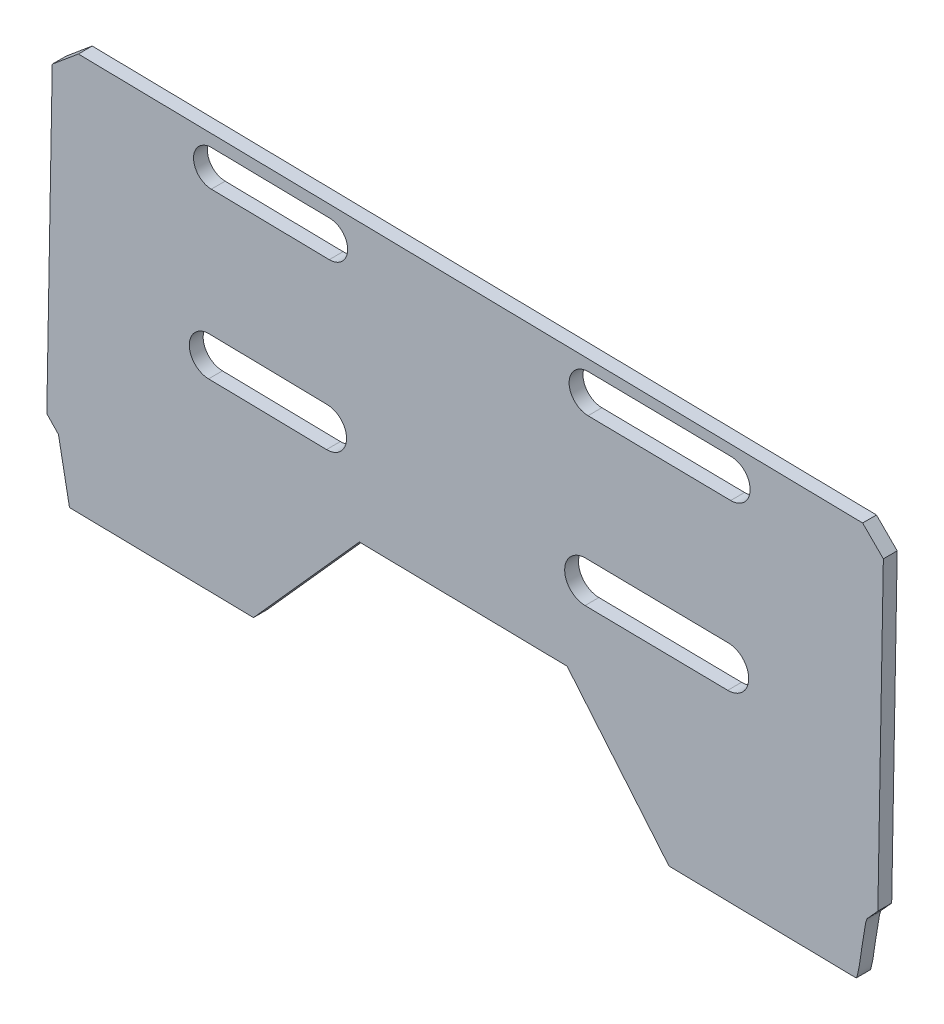
ISO-10303-21;
HEADER;
FILE_DESCRIPTION(('STEP AP214'),'2;1');
FILE_NAME('part.step','',(''),(''),'','','');
FILE_SCHEMA(('AUTOMOTIVE_DESIGN { 1 0 10303 214 1 1 1 1 }'));
ENDSEC;
DATA;
#1=APPLICATION_CONTEXT('core data for automotive mechanical design processes');
#2=APPLICATION_PROTOCOL_DEFINITION('international standard','automotive_design',2000,#1);
#3=PRODUCT_CONTEXT('',#1,'mechanical');
#4=PRODUCT('Part','Part','',(#3));
#5=PRODUCT_RELATED_PRODUCT_CATEGORY('part','',(#4));
#6=PRODUCT_DEFINITION_FORMATION('','',#4);
#7=PRODUCT_DEFINITION_CONTEXT('part definition',#1,'design');
#8=PRODUCT_DEFINITION('design','',#6,#7);
#9=PRODUCT_DEFINITION_SHAPE('','',#8);
#10=(LENGTH_UNIT() NAMED_UNIT(*) SI_UNIT(.MILLI.,.METRE.));
#11=(NAMED_UNIT(*) PLANE_ANGLE_UNIT() SI_UNIT($,.RADIAN.));
#12=(NAMED_UNIT(*) SI_UNIT($,.STERADIAN.) SOLID_ANGLE_UNIT());
#13=UNCERTAINTY_MEASURE_WITH_UNIT(LENGTH_MEASURE(1.E-05),#10,'distance_accuracy_value','');
#14=(GEOMETRIC_REPRESENTATION_CONTEXT(3) GLOBAL_UNCERTAINTY_ASSIGNED_CONTEXT((#13)) GLOBAL_UNIT_ASSIGNED_CONTEXT((#10,
#11,#12)) REPRESENTATION_CONTEXT('',''));
#15=CARTESIAN_POINT('',(0.,0.,0.));
#16=DIRECTION('',(0.,0.,1.));
#17=DIRECTION('',(1.,0.,0.));
#18=AXIS2_PLACEMENT_3D('',#15,#16,#17);
#19=CARTESIAN_POINT('',(189.712630334852,-41.2156411177829,3.5));
#20=CARTESIAN_POINT('',(190.597710334852,-40.2365511177829,3.5));
#21=CARTESIAN_POINT('',(191.646800334852,-27.7610111177829,3.5));
#22=CARTESIAN_POINT('',(192.531880334852,-26.7818511177829,3.5));
#23=B_SPLINE_CURVE_WITH_KNOTS('',3,(#19,#20,#21,#22),.UNSPECIFIED.,.F.,.F.,(4,4),
(0.926829268292683,0.951219512195122),.UNSPECIFIED.);
#24=DIRECTION('',(0.,0.,-1.));
#25=VECTOR('',#24,1.);
#26=SURFACE_OF_LINEAR_EXTRUSION('',#23,#25);
#27=CARTESIAN_POINT('',(189.712630334852,-41.2156411177829,0.));
#28=CARTESIAN_POINT('',(190.597710334852,-40.2365511177829,0.));
#29=CARTESIAN_POINT('',(191.646800334852,-27.7610111177829,0.));
#30=CARTESIAN_POINT('',(192.531880334852,-26.7818511177829,0.));
#31=B_SPLINE_CURVE_WITH_KNOTS('',3,(#27,#28,#29,#30),.UNSPECIFIED.,.F.,.F.,(4,4),
(0.926829268292683,0.951219512195122),.UNSPECIFIED.);
#32=CARTESIAN_POINT('',(189.712630334852,-41.2156411177829,0.));
#33=VERTEX_POINT('',#32);
#34=CARTESIAN_POINT('',(192.531880334852,-26.7818511177829,0.));
#35=VERTEX_POINT('',#34);
#36=EDGE_CURVE('E325',#33,#35,#31,.T.);
#37=ORIENTED_EDGE('',*,*,#36,.T.);
#38=DIRECTION('',(0.,0.,-1.));
#39=VECTOR('',#38,1.);
#40=CARTESIAN_POINT('',(192.531880334852,-26.7818511177829,3.5));
#41=LINE('',#40,#39);
#42=CARTESIAN_POINT('',(192.531880334852,-26.7818511177829,3.5));
#43=VERTEX_POINT('',#42);
#44=EDGE_CURVE('E11',#43,#35,#41,.T.);
#45=ORIENTED_EDGE('',*,*,#44,.F.);
#46=CARTESIAN_POINT('',(189.712630334852,-41.2156411177829,3.5));
#47=VERTEX_POINT('',#46);
#48=EDGE_CURVE('E482',#47,#43,#23,.T.);
#49=ORIENTED_EDGE('',*,*,#48,.F.);
#50=DIRECTION('',(0.,0.,-1.));
#51=VECTOR('',#50,1.);
#52=CARTESIAN_POINT('',(189.712630334852,-41.2156411177829,3.5));
#53=LINE('',#52,#51);
#54=EDGE_CURVE('E60',#47,#33,#53,.T.);
#55=ORIENTED_EDGE('',*,*,#54,.T.);
#56=EDGE_LOOP('',(#37,#45,#49,#55));
#57=FACE_BOUND('',#56,.T.);
#58=ADVANCED_FACE('F41',(#57),#26,.F.);
#59=CARTESIAN_POINT('',(192.531880334852,-26.7818511177829,3.5));
#60=CARTESIAN_POINT('',(193.416960334852,-25.8026911177829,3.5));
#61=CARTESIAN_POINT('',(194.302040334852,-24.8234611177829,3.5));
#62=CARTESIAN_POINT('',(195.187190334852,-23.8443011177829,3.5));
#63=B_SPLINE_CURVE_WITH_KNOTS('',3,(#59,#60,#61,#62),.UNSPECIFIED.,.F.,.F.,(4,4),
(0.951219512195122,1.),.UNSPECIFIED.);
#64=DIRECTION('',(0.,0.,-1.));
#65=VECTOR('',#64,1.);
#66=SURFACE_OF_LINEAR_EXTRUSION('',#63,#65);
#67=CARTESIAN_POINT('',(192.531880334852,-26.7818511177829,0.));
#68=CARTESIAN_POINT('',(193.416960334852,-25.8026911177829,0.));
#69=CARTESIAN_POINT('',(194.302040334852,-24.8234611177829,0.));
#70=CARTESIAN_POINT('',(195.187190334852,-23.8443011177829,0.));
#71=B_SPLINE_CURVE_WITH_KNOTS('',3,(#67,#68,#69,#70),.UNSPECIFIED.,.F.,.F.,(4,4),
(0.951219512195122,1.),.UNSPECIFIED.);
#72=CARTESIAN_POINT('',(195.187190334852,-23.8443011177829,0.));
#73=VERTEX_POINT('',#72);
#74=EDGE_CURVE('E329',#35,#73,#71,.T.);
#75=ORIENTED_EDGE('',*,*,#74,.T.);
#76=DIRECTION('',(0.,0.,-1.));
#77=VECTOR('',#76,1.);
#78=CARTESIAN_POINT('',(195.187190334852,-23.8443011177829,3.5));
#79=LINE('',#78,#77);
#80=CARTESIAN_POINT('',(195.187190334852,-23.8443011177829,3.5));
#81=VERTEX_POINT('',#80);
#82=EDGE_CURVE('E51',#81,#73,#79,.T.);
#83=ORIENTED_EDGE('',*,*,#82,.F.);
#84=EDGE_CURVE('E487',#43,#81,#63,.T.);
#85=ORIENTED_EDGE('',*,*,#84,.F.);
#86=ORIENTED_EDGE('',*,*,#44,.T.);
#87=EDGE_LOOP('',(#75,#83,#85,#86));
#88=FACE_BOUND('',#87,.T.);
#89=ADVANCED_FACE('F499',(#88),#66,.F.);
#90=CARTESIAN_POINT('',(195.5508581937,-3.49468877886996,3.5));
#91=DIRECTION('',(0.999840351974433,-0.0178681438219279,0.));
#92=DIRECTION('',(0.0178681438219279,0.999840351974433,0.));
#93=AXIS2_PLACEMENT_3D('',#90,#91,#92);
#94=PLANE('',#93);
#95=DIRECTION('',(-0.0178681438219279,-0.999840351974433,0.));
#96=VECTOR('',#95,1.);
#97=CARTESIAN_POINT('',(195.5508581937,-3.49468877886996,0.));
#98=LINE('',#97,#96);
#99=CARTESIAN_POINT('',(196.577110334852,53.9308788822172,0.));
#100=VERTEX_POINT('',#99);
#101=EDGE_CURVE('E337',#100,#73,#98,.T.);
#102=ORIENTED_EDGE('',*,*,#101,.F.);
#103=DIRECTION('',(0.,0.,-1.));
#104=VECTOR('',#103,1.);
#105=CARTESIAN_POINT('',(196.577110334852,53.9308788822172,3.5));
#106=LINE('',#105,#104);
#107=CARTESIAN_POINT('',(196.577110334852,53.9308788822172,3.5));
#108=VERTEX_POINT('',#107);
#109=EDGE_CURVE('E392',#108,#100,#106,.T.);
#110=ORIENTED_EDGE('',*,*,#109,.F.);
#111=DIRECTION('',(-0.0178681438219279,-0.999840351974433,0.));
#112=VECTOR('',#111,1.);
#113=CARTESIAN_POINT('',(195.5508581937,-3.49468877886996,3.5));
#114=LINE('',#113,#112);
#115=EDGE_CURVE('E799',#108,#81,#114,.T.);
#116=ORIENTED_EDGE('',*,*,#115,.T.);
#117=ORIENTED_EDGE('',*,*,#82,.T.);
#118=EDGE_LOOP('',(#102,#110,#116,#117));
#119=FACE_BOUND('',#118,.T.);
#120=ADVANCED_FACE('F670',(#119),#94,.T.);
#121=CARTESIAN_POINT('',(125.129053481797,125.288186816212,3.5));
#122=DIRECTION('',(0.706657291406756,0.707555985418586,0.));
#123=DIRECTION('',(-0.707555985418586,0.706657291406756,0.));
#124=AXIS2_PLACEMENT_3D('',#121,#122,#123);
#125=PLANE('',#124);
#126=DIRECTION('',(0.707555985418586,-0.706657291406756,0.));
#127=VECTOR('',#126,1.);
#128=CARTESIAN_POINT('',(125.129053481797,125.288186816212,0.));
#129=LINE('',#128,#127);
#130=CARTESIAN_POINT('',(191.341460334852,59.1598788822171,0.));
#131=VERTEX_POINT('',#130);
#132=EDGE_CURVE('E343',#131,#100,#129,.T.);
#133=ORIENTED_EDGE('',*,*,#132,.F.);
#134=DIRECTION('',(0.,0.,-1.));
#135=VECTOR('',#134,1.);
#136=CARTESIAN_POINT('',(191.341460334852,59.1598788822171,3.5));
#137=LINE('',#136,#135);
#138=CARTESIAN_POINT('',(191.341460334852,59.1598788822171,3.5));
#139=VERTEX_POINT('',#138);
#140=EDGE_CURVE('E390',#139,#131,#137,.T.);
#141=ORIENTED_EDGE('',*,*,#140,.F.);
#142=DIRECTION('',(0.707555985418586,-0.706657291406756,0.));
#143=VECTOR('',#142,1.);
#144=CARTESIAN_POINT('',(125.129053481797,125.288186816212,3.5));
#145=LINE('',#144,#143);
#146=EDGE_CURVE('E800',#139,#108,#145,.T.);
#147=ORIENTED_EDGE('',*,*,#146,.T.);
#148=ORIENTED_EDGE('',*,*,#109,.T.);
#149=EDGE_LOOP('',(#133,#141,#147,#148));
#150=FACE_BOUND('',#149,.T.);
#151=ADVANCED_FACE('F662',(#150),#125,.T.);
#152=CARTESIAN_POINT('',(1.11802061192249,62.5594261536194,3.5));
#153=DIRECTION('',(0.0178684841608716,0.999840345892179,0.));
#154=DIRECTION('',(-0.999840345892179,0.0178684841608716,0.));
#155=AXIS2_PLACEMENT_3D('',#152,#153,#154);
#156=PLANE('',#155);
#157=DIRECTION('',(0.999840345892179,-0.0178684841608716,0.));
#158=VECTOR('',#157,1.);
#159=CARTESIAN_POINT('',(1.11802061192249,62.5594261536194,0.));
#160=LINE('',#159,#158);
#161=CARTESIAN_POINT('',(-6.79815966514825,62.7008988822171,0.));
#162=VERTEX_POINT('',#161);
#163=EDGE_CURVE('E346',#162,#131,#160,.T.);
#164=ORIENTED_EDGE('',*,*,#163,.F.);
#165=DIRECTION('',(0.,0.,-1.));
#166=VECTOR('',#165,1.);
#167=CARTESIAN_POINT('',(-6.79815966514825,62.7008988822171,3.5));
#168=LINE('',#167,#166);
#169=CARTESIAN_POINT('',(-6.79815966514825,62.7008988822171,3.5));
#170=VERTEX_POINT('',#169);
#171=EDGE_CURVE('E388',#170,#162,#168,.T.);
#172=ORIENTED_EDGE('',*,*,#171,.F.);
#173=DIRECTION('',(0.999840345892179,-0.0178684841608716,0.));
#174=VECTOR('',#173,1.);
#175=CARTESIAN_POINT('',(1.11802061192249,62.5594261536194,3.5));
#176=LINE('',#175,#174);
#177=EDGE_CURVE('E802',#170,#139,#176,.T.);
#178=ORIENTED_EDGE('',*,*,#177,.T.);
#179=ORIENTED_EDGE('',*,*,#140,.T.);
#180=EDGE_LOOP('',(#164,#172,#178,#179));
#181=FACE_BOUND('',#180,.T.);
#182=ADVANCED_FACE('F654',(#181),#156,.T.);
#183=CARTESIAN_POINT('',(-33.641178836427,40.2846461990089,3.5));
#184=DIRECTION('',(-0.640978381306723,0.767558932393737,0.));
#185=DIRECTION('',(-0.767558932393737,-0.640978381306723,0.));
#186=AXIS2_PLACEMENT_3D('',#183,#184,#185);
#187=PLANE('',#186);
#188=DIRECTION('',(0.767558932393737,0.640978381306723,0.));
#189=VECTOR('',#188,1.);
#190=CARTESIAN_POINT('',(-33.641178836427,40.2846461990089,0.));
#191=LINE('',#190,#189);
#192=CARTESIAN_POINT('',(-13.3981796651483,57.1893088822171,0.));
#193=VERTEX_POINT('',#192);
#194=EDGE_CURVE('E349',#193,#162,#191,.T.);
#195=ORIENTED_EDGE('',*,*,#194,.F.);
#196=DIRECTION('',(0.,0.,-1.));
#197=VECTOR('',#196,1.);
#198=CARTESIAN_POINT('',(-13.3981796651483,57.1893088822171,3.5));
#199=LINE('',#198,#197);
#200=CARTESIAN_POINT('',(-13.3981796651483,57.1893088822171,3.5));
#201=VERTEX_POINT('',#200);
#202=EDGE_CURVE('E386',#201,#193,#199,.T.);
#203=ORIENTED_EDGE('',*,*,#202,.F.);
#204=DIRECTION('',(0.767558932393737,0.640978381306723,0.));
#205=VECTOR('',#204,1.);
#206=CARTESIAN_POINT('',(-33.641178836427,40.2846461990089,3.5));
#207=LINE('',#206,#205);
#208=EDGE_CURVE('E807',#201,#170,#207,.T.);
#209=ORIENTED_EDGE('',*,*,#208,.T.);
#210=ORIENTED_EDGE('',*,*,#171,.T.);
#211=EDGE_LOOP('',(#195,#203,#209,#210));
#212=FACE_BOUND('',#211,.T.);
#213=ADVANCED_FACE('F646',(#212),#187,.T.);
#214=CARTESIAN_POINT('',(-14.4155844214953,0.25761545587832,3.5));
#215=DIRECTION('',(0.999840358676074,-0.0178677688170455,0.));
#216=DIRECTION('',(0.0178677688170455,0.999840358676074,0.));
#217=AXIS2_PLACEMENT_3D('',#214,#215,#216);
#218=PLANE('',#217);
#219=DIRECTION('',(-0.0178677688170455,-0.999840358676074,0.));
#220=VECTOR('',#219,1.);
#221=CARTESIAN_POINT('',(-14.4155844214953,0.25761545587832,0.));
#222=LINE('',#221,#220);
#223=CARTESIAN_POINT('',(-14.7770396651482,-19.9686111177829,0.));
#224=VERTEX_POINT('',#223);
#225=EDGE_CURVE('E352',#193,#224,#222,.T.);
#226=ORIENTED_EDGE('',*,*,#225,.T.);
#227=DIRECTION('',(0.,0.,-1.));
#228=VECTOR('',#227,1.);
#229=CARTESIAN_POINT('',(-14.7770396651482,-19.9686111177829,3.5));
#230=LINE('',#229,#228);
#231=CARTESIAN_POINT('',(-14.7770396651482,-19.9686111177829,3.5));
#232=VERTEX_POINT('',#231);
#233=EDGE_CURVE('E383',#232,#224,#230,.T.);
#234=ORIENTED_EDGE('',*,*,#233,.F.);
#235=DIRECTION('',(-0.0178677688170455,-0.999840358676074,0.));
#236=VECTOR('',#235,1.);
#237=CARTESIAN_POINT('',(-14.4155844214953,0.25761545587832,3.5));
#238=LINE('',#237,#236);
#239=EDGE_CURVE('E810',#201,#232,#238,.T.);
#240=ORIENTED_EDGE('',*,*,#239,.F.);
#241=ORIENTED_EDGE('',*,*,#202,.T.);
#242=EDGE_LOOP('',(#226,#234,#240,#241));
#243=FACE_BOUND('',#242,.T.);
#244=ADVANCED_FACE('F638',(#243),#218,.F.);
#245=CARTESIAN_POINT('',(-17.7295798860647,-16.8646441973417,3.5));
#246=DIRECTION('',(0.724559656241038,0.689212089670421,0.));
#247=DIRECTION('',(-0.689212089670421,0.724559656241038,0.));
#248=AXIS2_PLACEMENT_3D('',#245,#246,#247);
#249=PLANE('',#248);
#250=DIRECTION('',(0.689212089670421,-0.724559656241038,0.));
#251=VECTOR('',#250,1.);
#252=CARTESIAN_POINT('',(-17.7295798860647,-16.8646441973417,0.));
#253=LINE('',#252,#251);
#254=CARTESIAN_POINT('',(-11.8289196651482,-23.0679311177829,0.));
#255=VERTEX_POINT('',#254);
#256=EDGE_CURVE('E354',#224,#255,#253,.T.);
#257=ORIENTED_EDGE('',*,*,#256,.T.);
#258=DIRECTION('',(0.,0.,-1.));
#259=VECTOR('',#258,1.);
#260=CARTESIAN_POINT('',(-11.8289196651482,-23.0679311177829,3.5));
#261=LINE('',#260,#259);
#262=CARTESIAN_POINT('',(-11.8289196651482,-23.0679311177829,3.5));
#263=VERTEX_POINT('',#262);
#264=EDGE_CURVE('E380',#263,#255,#261,.T.);
#265=ORIENTED_EDGE('',*,*,#264,.F.);
#266=DIRECTION('',(0.689212089670421,-0.724559656241038,0.));
#267=VECTOR('',#266,1.);
#268=CARTESIAN_POINT('',(-17.7295798860647,-16.8646441973417,3.5));
#269=LINE('',#268,#267);
#270=EDGE_CURVE('E812',#232,#263,#269,.T.);
#271=ORIENTED_EDGE('',*,*,#270,.F.);
#272=ORIENTED_EDGE('',*,*,#233,.T.);
#273=EDGE_LOOP('',(#257,#265,#271,#272));
#274=FACE_BOUND('',#273,.T.);
#275=ADVANCED_FACE('F630',(#274),#249,.F.);
#276=CARTESIAN_POINT('',(-15.6594890108642,-2.9871765162684,3.5));
#277=DIRECTION('',(0.982287606039838,0.187379451969855,0.));
#278=DIRECTION('',(-0.187379451969855,0.982287606039838,0.));
#279=AXIS2_PLACEMENT_3D('',#276,#277,#278);
#280=PLANE('',#279);
#281=DIRECTION('',(0.187379451969855,-0.982287606039838,0.));
#282=VECTOR('',#281,1.);
#283=CARTESIAN_POINT('',(-15.6594890108642,-2.9871765162684,0.));
#284=LINE('',#283,#282);
#285=CARTESIAN_POINT('',(-9.04466966514825,-37.6636311177829,0.));
#286=VERTEX_POINT('',#285);
#287=EDGE_CURVE('E356',#255,#286,#284,.T.);
#288=ORIENTED_EDGE('',*,*,#287,.T.);
#289=DIRECTION('',(0.,0.,-1.));
#290=VECTOR('',#289,1.);
#291=CARTESIAN_POINT('',(-9.04466966514825,-37.6636311177829,3.5));
#292=LINE('',#291,#290);
#293=CARTESIAN_POINT('',(-9.04466966514825,-37.6636311177829,3.5));
#294=VERTEX_POINT('',#293);
#295=EDGE_CURVE('E378',#294,#286,#292,.T.);
#296=ORIENTED_EDGE('',*,*,#295,.F.);
#297=DIRECTION('',(0.187379451969855,-0.982287606039838,0.));
#298=VECTOR('',#297,1.);
#299=CARTESIAN_POINT('',(-15.6594890108642,-2.9871765162684,3.5));
#300=LINE('',#299,#298);
#301=EDGE_CURVE('E814',#263,#294,#300,.T.);
#302=ORIENTED_EDGE('',*,*,#301,.F.);
#303=ORIENTED_EDGE('',*,*,#264,.T.);
#304=EDGE_LOOP('',(#288,#296,#302,#303));
#305=FACE_BOUND('',#304,.T.);
#306=ADVANCED_FACE('F622',(#305),#280,.F.);
#307=CARTESIAN_POINT('',(-0.675817377512351,-37.8132036285223,3.5));
#308=DIRECTION('',(-0.0178696698859134,-0.999840324700984,0.));
#309=DIRECTION('',(0.999840324700984,-0.0178696698859134,0.));
#310=AXIS2_PLACEMENT_3D('',#307,#308,#309);
#311=PLANE('',#310);
#312=DIRECTION('',(-0.999840324700984,0.0178696698859134,0.));
#313=VECTOR('',#312,1.);
#314=CARTESIAN_POINT('',(-0.675817377512351,-37.8132036285223,0.));
#315=LINE('',#314,#313);
#316=CARTESIAN_POINT('',(37.4417703348518,-38.4944611177829,0.));
#317=VERTEX_POINT('',#316);
#318=EDGE_CURVE('E359',#317,#286,#315,.T.);
#319=ORIENTED_EDGE('',*,*,#318,.F.);
#320=DIRECTION('',(0.,0.,-1.));
#321=VECTOR('',#320,1.);
#322=CARTESIAN_POINT('',(37.4417703348518,-38.4944611177829,3.5));
#323=LINE('',#322,#321);
#324=CARTESIAN_POINT('',(37.4417703348518,-38.4944611177829,3.5));
#325=VERTEX_POINT('',#324);
#326=EDGE_CURVE('E376',#325,#317,#323,.T.);
#327=ORIENTED_EDGE('',*,*,#326,.F.);
#328=DIRECTION('',(-0.999840324700984,0.0178696698859134,0.));
#329=VECTOR('',#328,1.);
#330=CARTESIAN_POINT('',(-0.675817377512351,-37.8132036285223,3.5));
#331=LINE('',#330,#329);
#332=EDGE_CURVE('E271',#325,#294,#331,.T.);
#333=ORIENTED_EDGE('',*,*,#332,.T.);
#334=ORIENTED_EDGE('',*,*,#295,.T.);
#335=EDGE_LOOP('',(#319,#327,#333,#334));
#336=FACE_BOUND('',#335,.T.);
#337=ADVANCED_FACE('F614',(#336),#311,.T.);
#338=CARTESIAN_POINT('',(39.9351512914236,-35.7057340892636,3.5));
#339=DIRECTION('',(-0.745479822272443,0.666528194890994,0.));
#340=DIRECTION('',(-0.666528194890994,-0.745479822272443,0.));
#341=AXIS2_PLACEMENT_3D('',#338,#339,#340);
#342=PLANE('',#341);
#343=DIRECTION('',(0.666528194890994,0.745479822272443,0.));
#344=VECTOR('',#343,1.);
#345=CARTESIAN_POINT('',(39.9351512914236,-35.7057340892636,0.));
#346=LINE('',#345,#344);
#347=CARTESIAN_POINT('',(64.1890503348518,-8.57891111778286,0.));
#348=VERTEX_POINT('',#347);
#349=EDGE_CURVE('E362',#317,#348,#346,.T.);
#350=ORIENTED_EDGE('',*,*,#349,.T.);
#351=DIRECTION('',(0.,0.,-1.));
#352=VECTOR('',#351,1.);
#353=CARTESIAN_POINT('',(64.1890503348518,-8.57891111778286,3.5));
#354=LINE('',#353,#352);
#355=CARTESIAN_POINT('',(64.1890503348518,-8.57891111778286,3.5));
#356=VERTEX_POINT('',#355);
#357=EDGE_CURVE('E256',#356,#348,#354,.T.);
#358=ORIENTED_EDGE('',*,*,#357,.F.);
#359=DIRECTION('',(0.666528194890994,0.745479822272443,0.));
#360=VECTOR('',#359,1.);
#361=CARTESIAN_POINT('',(39.9351512914236,-35.7057340892636,3.5));
#362=LINE('',#361,#360);
#363=EDGE_CURVE('E268',#325,#356,#362,.T.);
#364=ORIENTED_EDGE('',*,*,#363,.F.);
#365=ORIENTED_EDGE('',*,*,#326,.T.);
#366=EDGE_LOOP('',(#350,#358,#364,#365));
#367=FACE_BOUND('',#366,.T.);
#368=ADVANCED_FACE('F607',(#367),#342,.F.);
#369=CARTESIAN_POINT('',(-0.132770207534705,-7.42942491053834,3.5));
#370=DIRECTION('',(-0.017868006333995,-0.99984035443147,0.));
#371=DIRECTION('',(0.99984035443147,-0.017868006333995,0.));
#372=AXIS2_PLACEMENT_3D('',#369,#370,#371);
#373=PLANE('',#372);
#374=DIRECTION('',(-0.999840354431471,0.017868006333995,0.));
#375=VECTOR('',#374,1.);
#376=CARTESIAN_POINT('',(-0.132770207534705,-7.42942491053834,0.));
#377=LINE('',#376,#375);
#378=CARTESIAN_POINT('',(116.680650334852,-9.51698111778286,0.));
#379=VERTEX_POINT('',#378);
#380=EDGE_CURVE('E253',#379,#348,#377,.T.);
#381=ORIENTED_EDGE('',*,*,#380,.F.);
#382=DIRECTION('',(0.,0.,-1.));
#383=VECTOR('',#382,1.);
#384=CARTESIAN_POINT('',(116.680650334852,-9.51698111778286,3.5));
#385=LINE('',#384,#383);
#386=CARTESIAN_POINT('',(116.680650334852,-9.51698111778286,3.5));
#387=VERTEX_POINT('',#386);
#388=EDGE_CURVE('E247',#387,#379,#385,.T.);
#389=ORIENTED_EDGE('',*,*,#388,.F.);
#390=DIRECTION('',(-0.999840354431471,0.017868006333995,0.));
#391=VECTOR('',#390,1.);
#392=CARTESIAN_POINT('',(-0.132770207534705,-7.42942491053834,3.5));
#393=LINE('',#392,#391);
#394=EDGE_CURVE('E251',#387,#356,#393,.T.);
#395=ORIENTED_EDGE('',*,*,#394,.T.);
#396=ORIENTED_EDGE('',*,*,#357,.T.);
#397=EDGE_LOOP('',(#381,#389,#395,#396));
#398=FACE_BOUND('',#397,.T.);
#399=ADVANCED_FACE('F249',(#398),#373,.T.);
#400=CARTESIAN_POINT('',(64.1066729518021,53.4908528388642,3.5));
#401=DIRECTION('',(0.767816894533482,0.640669350343031,0.));
#402=DIRECTION('',(-0.640669350343031,0.767816894533482,0.));
#403=AXIS2_PLACEMENT_3D('',#400,#401,#402);
#404=PLANE('',#403);
#405=DIRECTION('',(0.640669350343031,-0.767816894533482,0.));
#406=VECTOR('',#405,1.);
#407=CARTESIAN_POINT('',(64.1066729518021,53.4908528388642,0.));
#408=LINE('',#407,#406);
#409=CARTESIAN_POINT('',(142.424970334852,-40.3705311177829,0.));
#410=VERTEX_POINT('',#409);
#411=EDGE_CURVE('E366',#379,#410,#408,.T.);
#412=ORIENTED_EDGE('',*,*,#411,.T.);
#413=DIRECTION('',(0.,0.,-1.));
#414=VECTOR('',#413,1.);
#415=CARTESIAN_POINT('',(142.424970334852,-40.3705311177829,3.5));
#416=LINE('',#415,#414);
#417=CARTESIAN_POINT('',(142.424970334852,-40.3705311177829,3.5));
#418=VERTEX_POINT('',#417);
#419=EDGE_CURVE('E153',#418,#410,#416,.T.);
#420=ORIENTED_EDGE('',*,*,#419,.F.);
#421=DIRECTION('',(0.640669350343031,-0.767816894533482,0.));
#422=VECTOR('',#421,1.);
#423=CARTESIAN_POINT('',(64.1066729518021,53.4908528388642,3.5));
#424=LINE('',#423,#422);
#425=EDGE_CURVE('E258',#387,#418,#424,.T.);
#426=ORIENTED_EDGE('',*,*,#425,.F.);
#427=ORIENTED_EDGE('',*,*,#388,.T.);
#428=EDGE_LOOP('',(#412,#420,#426,#427));
#429=FACE_BOUND('',#428,.T.);
#430=ADVANCED_FACE('F259',(#429),#404,.F.);
#431=CARTESIAN_POINT('',(26.1924081525457,13.0321981525457,3.5));
#432=DIRECTION('',(0.,0.,-1.));
#433=DIRECTION('',(-1.,0.,0.));
#434=AXIS2_PLACEMENT_3D('',#431,#432,#433);
#435=CYLINDRICAL_SURFACE('',#434,4.96444405954844);
#436=CARTESIAN_POINT('',(26.1924081525457,13.0321981525457,0.));
#437=DIRECTION('',(0.,0.,1.));
#438=DIRECTION('',(1.,0.,0.));
#439=AXIS2_PLACEMENT_3D('',#436,#437,#438);
#440=CIRCLE('',#439,4.96444405954844);
#441=CARTESIAN_POINT('',(26.2864253865253,17.995751877459,0.));
#442=VERTEX_POINT('',#441);
#443=CARTESIAN_POINT('',(26.0983909185662,8.06864442763242,0.));
#444=VERTEX_POINT('',#443);
#445=EDGE_CURVE('E313',#442,#444,#440,.T.);
#446=ORIENTED_EDGE('',*,*,#445,.F.);
#447=DIRECTION('',(0.,0.,-1.));
#448=VECTOR('',#447,1.);
#449=CARTESIAN_POINT('',(26.2864253865253,17.995751877459,3.5));
#450=LINE('',#449,#448);
#451=CARTESIAN_POINT('',(26.2864253865253,17.995751877459,3.5));
#452=VERTEX_POINT('',#451);
#453=EDGE_CURVE('E373',#452,#442,#450,.T.);
#454=ORIENTED_EDGE('',*,*,#453,.F.);
#455=CARTESIAN_POINT('',(26.1924081525457,13.0321981525457,3.5));
#456=DIRECTION('',(0.,0.,1.));
#457=DIRECTION('',(1.,0.,0.));
#458=AXIS2_PLACEMENT_3D('',#455,#456,#457);
#459=CIRCLE('',#458,4.96444405954844);
#460=CARTESIAN_POINT('',(26.0983909185662,8.06864442763242,3.5));
#461=VERTEX_POINT('',#460);
#462=EDGE_CURVE('E471',#452,#461,#459,.T.);
#463=ORIENTED_EDGE('',*,*,#462,.T.);
#464=DIRECTION('',(0.,0.,-1.));
#465=VECTOR('',#464,1.);
#466=CARTESIAN_POINT('',(26.0983909185662,8.06864442763242,3.5));
#467=LINE('',#466,#465);
#468=EDGE_CURVE('E395',#461,#444,#467,.T.);
#469=ORIENTED_EDGE('',*,*,#468,.T.);
#470=EDGE_LOOP('',(#446,#454,#463,#469));
#471=FACE_BOUND('',#470,.T.);
#472=ADVANCED_FACE('F514',(#471),#435,.F.);
#473=CARTESIAN_POINT('',(0.350172264118592,18.4870238397475,3.5));
#474=DIRECTION('',(-0.0189381193245044,-0.999820657736402,0.));
#475=DIRECTION('',(0.999820657736402,-0.0189381193245044,0.));
#476=AXIS2_PLACEMENT_3D('',#473,#474,#475);
#477=PLANE('',#476);
#478=DIRECTION('',(-0.999820657736402,0.0189381193245044,0.));
#479=VECTOR('',#478,1.);
#480=CARTESIAN_POINT('',(0.350172264118592,18.4870238397475,0.));
#481=LINE('',#480,#479);
#482=CARTESIAN_POINT('',(56.086913670907,17.4312854417126,0.));
#483=VERTEX_POINT('',#482);
#484=EDGE_CURVE('E316',#483,#442,#481,.T.);
#485=ORIENTED_EDGE('',*,*,#484,.F.);
#486=DIRECTION('',(0.,0.,-1.));
#487=VECTOR('',#486,1.);
#488=CARTESIAN_POINT('',(56.086913670907,17.4312854417126,3.5));
#489=LINE('',#488,#487);
#490=CARTESIAN_POINT('',(56.086913670907,17.4312854417126,3.5));
#491=VERTEX_POINT('',#490);
#492=EDGE_CURVE('E400',#491,#483,#489,.T.);
#493=ORIENTED_EDGE('',*,*,#492,.F.);
#494=DIRECTION('',(-0.999820657736402,0.0189381193245044,0.));
#495=VECTOR('',#494,1.);
#496=CARTESIAN_POINT('',(0.350172264118592,18.4870238397475,3.5));
#497=LINE('',#496,#495);
#498=EDGE_CURVE('E474',#491,#452,#497,.T.);
#499=ORIENTED_EDGE('',*,*,#498,.T.);
#500=ORIENTED_EDGE('',*,*,#453,.T.);
#501=EDGE_LOOP('',(#485,#493,#499,#500));
#502=FACE_BOUND('',#501,.T.);
#503=ADVANCED_FACE('F510',(#502),#477,.T.);
#504=CARTESIAN_POINT('',(55.9928964369274,12.4677317167993,3.5));
#505=DIRECTION('',(0.,0.,-1.));
#506=DIRECTION('',(-1.,0.,0.));
#507=AXIS2_PLACEMENT_3D('',#504,#505,#506);
#508=CYLINDRICAL_SURFACE('',#507,4.96444405954844);
#509=CARTESIAN_POINT('',(55.9928964369274,12.4677317167993,0.));
#510=DIRECTION('',(0.,0.,1.));
#511=DIRECTION('',(1.,0.,0.));
#512=AXIS2_PLACEMENT_3D('',#509,#510,#511);
#513=CIRCLE('',#512,4.96444405954844);
#514=CARTESIAN_POINT('',(55.8988792029479,7.50417799188599,0.));
#515=VERTEX_POINT('',#514);
#516=EDGE_CURVE('E319',#515,#483,#513,.T.);
#517=ORIENTED_EDGE('',*,*,#516,.F.);
#518=DIRECTION('',(0.,0.,-1.));
#519=VECTOR('',#518,1.);
#520=CARTESIAN_POINT('',(55.8988792029479,7.50417799188599,3.5));
#521=LINE('',#520,#519);
#522=CARTESIAN_POINT('',(55.8988792029479,7.50417799188599,3.5));
#523=VERTEX_POINT('',#522);
#524=EDGE_CURVE('E397',#523,#515,#521,.T.);
#525=ORIENTED_EDGE('',*,*,#524,.F.);
#526=CARTESIAN_POINT('',(55.9928964369274,12.4677317167993,3.5));
#527=DIRECTION('',(0.,0.,1.));
#528=DIRECTION('',(1.,0.,0.));
#529=AXIS2_PLACEMENT_3D('',#526,#527,#528);
#530=CIRCLE('',#529,4.96444405954844);
#531=EDGE_CURVE('E477',#523,#491,#530,.T.);
#532=ORIENTED_EDGE('',*,*,#531,.T.);
#533=ORIENTED_EDGE('',*,*,#492,.T.);
#534=EDGE_LOOP('',(#517,#525,#532,#533));
#535=FACE_BOUND('',#534,.T.);
#536=ADVANCED_FACE('F506',(#535),#508,.F.);
#537=CARTESIAN_POINT('',(157.332259164902,10.7277664979275,3.5));
#538=DIRECTION('',(0.,0.,-1.));
#539=DIRECTION('',(-1.,0.,0.));
#540=AXIS2_PLACEMENT_3D('',#537,#538,#539);
#541=CYLINDRICAL_SURFACE('',#540,5.22258962180808);
#542=CARTESIAN_POINT('',(157.332259164902,10.7277664979275,0.));
#543=DIRECTION('',(0.,0.,1.));
#544=DIRECTION('',(1.,0.,0.));
#545=AXIS2_PLACEMENT_3D('',#542,#543,#544);
#546=CIRCLE('',#545,5.22258962180808);
#547=CARTESIAN_POINT('',(157.256311569817,5.50572912534788,0.));
#548=VERTEX_POINT('',#547);
#549=CARTESIAN_POINT('',(157.408206759987,15.9498038705071,0.));
#550=VERTEX_POINT('',#549);
#551=EDGE_CURVE('E301',#548,#550,#546,.T.);
#552=ORIENTED_EDGE('',*,*,#551,.F.);
#553=DIRECTION('',(0.,0.,-1.));
#554=VECTOR('',#553,1.);
#555=CARTESIAN_POINT('',(157.256311569817,5.50572912534788,3.5));
#556=LINE('',#555,#554);
#557=CARTESIAN_POINT('',(157.256311569817,5.50572912534788,3.5));
#558=VERTEX_POINT('',#557);
#559=EDGE_CURVE('E398',#558,#548,#556,.T.);
#560=ORIENTED_EDGE('',*,*,#559,.F.);
#561=CARTESIAN_POINT('',(157.332259164902,10.7277664979275,3.5));
#562=DIRECTION('',(0.,0.,1.));
#563=DIRECTION('',(1.,0.,0.));
#564=AXIS2_PLACEMENT_3D('',#561,#562,#563);
#565=CIRCLE('',#564,5.22258962180808);
#566=CARTESIAN_POINT('',(157.408206759987,15.9498038705071,3.5));
#567=VERTEX_POINT('',#566);
#568=EDGE_CURVE('E460',#558,#567,#565,.T.);
#569=ORIENTED_EDGE('',*,*,#568,.T.);
#570=DIRECTION('',(0.,0.,-1.));
#571=VECTOR('',#570,1.);
#572=CARTESIAN_POINT('',(157.408206759987,15.9498038705071,3.5));
#573=LINE('',#572,#571);
#574=EDGE_CURVE('E403',#567,#550,#573,.T.);
#575=ORIENTED_EDGE('',*,*,#574,.T.);
#576=EDGE_LOOP('',(#552,#560,#569,#575));
#577=FACE_BOUND('',#576,.T.);
#578=ADVANCED_FACE('F509',(#577),#541,.F.);
#579=CARTESIAN_POINT('',(0.113312146571181,7.79116525672821,3.5));
#580=DIRECTION('',(0.014542133421383,0.999894257587048,0.));
#581=DIRECTION('',(-0.999894257587048,0.014542133421383,0.));
#582=AXIS2_PLACEMENT_3D('',#579,#580,#581);
#583=PLANE('',#582);
#584=DIRECTION('',(0.999894257587048,-0.014542133421383,0.));
#585=VECTOR('',#584,1.);
#586=CARTESIAN_POINT('',(0.113312146571181,7.79116525672821,0.));
#587=LINE('',#586,#585);
#588=CARTESIAN_POINT('',(121.209223240013,6.02998612949289,0.));
#589=VERTEX_POINT('',#588);
#590=EDGE_CURVE('E304',#589,#548,#587,.T.);
#591=ORIENTED_EDGE('',*,*,#590,.F.);
#592=DIRECTION('',(0.,0.,-1.));
#593=VECTOR('',#592,1.);
#594=CARTESIAN_POINT('',(121.209223240013,6.02998612949289,3.5));
#595=LINE('',#594,#593);
#596=CARTESIAN_POINT('',(121.209223240013,6.02998612949289,3.5));
#597=VERTEX_POINT('',#596);
#598=EDGE_CURVE('E408',#597,#589,#595,.T.);
#599=ORIENTED_EDGE('',*,*,#598,.F.);
#600=DIRECTION('',(0.999894257587048,-0.014542133421383,0.));
#601=VECTOR('',#600,1.);
#602=CARTESIAN_POINT('',(0.113312146571181,7.79116525672821,3.5));
#603=LINE('',#602,#601);
#604=EDGE_CURVE('E463',#597,#558,#603,.T.);
#605=ORIENTED_EDGE('',*,*,#604,.T.);
#606=ORIENTED_EDGE('',*,*,#559,.T.);
#607=EDGE_LOOP('',(#591,#599,#605,#606));
#608=FACE_BOUND('',#607,.T.);
#609=ADVANCED_FACE('F527',(#608),#583,.T.);
#610=CARTESIAN_POINT('',(121.285170835098,11.2520235020725,3.5));
#611=DIRECTION('',(0.,0.,-1.));
#612=DIRECTION('',(-1.,0.,0.));
#613=AXIS2_PLACEMENT_3D('',#610,#611,#612);
#614=CYLINDRICAL_SURFACE('',#613,5.22258962180808);
#615=CARTESIAN_POINT('',(121.285170835098,11.2520235020725,0.));
#616=DIRECTION('',(0.,0.,1.));
#617=DIRECTION('',(1.,0.,0.));
#618=AXIS2_PLACEMENT_3D('',#615,#616,#617);
#619=CIRCLE('',#618,5.22258962180808);
#620=CARTESIAN_POINT('',(121.361118430183,16.4740608746521,0.));
#621=VERTEX_POINT('',#620);
#622=EDGE_CURVE('E307',#621,#589,#619,.T.);
#623=ORIENTED_EDGE('',*,*,#622,.F.);
#624=DIRECTION('',(0.,0.,-1.));
#625=VECTOR('',#624,1.);
#626=CARTESIAN_POINT('',(121.361118430183,16.4740608746521,3.5));
#627=LINE('',#626,#625);
#628=CARTESIAN_POINT('',(121.361118430183,16.4740608746521,3.5));
#629=VERTEX_POINT('',#628);
#630=EDGE_CURVE('E405',#629,#621,#627,.T.);
#631=ORIENTED_EDGE('',*,*,#630,.F.);
#632=CARTESIAN_POINT('',(121.285170835098,11.2520235020725,3.5));
#633=DIRECTION('',(0.,0.,1.));
#634=DIRECTION('',(1.,0.,0.));
#635=AXIS2_PLACEMENT_3D('',#632,#633,#634);
#636=CIRCLE('',#635,5.22258962180808);
#637=EDGE_CURVE('E466',#629,#597,#636,.T.);
#638=ORIENTED_EDGE('',*,*,#637,.T.);
#639=ORIENTED_EDGE('',*,*,#598,.T.);
#640=EDGE_LOOP('',(#623,#631,#638,#639));
#641=FACE_BOUND('',#640,.T.);
#642=ADVANCED_FACE('F523',(#641),#614,.F.);
#643=CARTESIAN_POINT('',(158.074845235004,52.2516395951315,3.5));
#644=DIRECTION('',(0.,0.,-1.));
#645=DIRECTION('',(-1.,0.,0.));
#646=AXIS2_PLACEMENT_3D('',#643,#644,#645);
#647=CYLINDRICAL_SURFACE('',#646,4.83974727922403);
#648=CARTESIAN_POINT('',(158.074845235004,52.2516395951315,0.));
#649=DIRECTION('',(0.,0.,1.));
#650=DIRECTION('',(1.,0.,0.));
#651=AXIS2_PLACEMENT_3D('',#648,#649,#650);
#652=CIRCLE('',#651,4.83974727922403);
#653=CARTESIAN_POINT('',(158.004498563419,47.4124035942164,0.));
#654=VERTEX_POINT('',#653);
#655=CARTESIAN_POINT('',(158.14519190659,57.0908755960467,0.));
#656=VERTEX_POINT('',#655);
#657=EDGE_CURVE('E289',#654,#656,#652,.T.);
#658=ORIENTED_EDGE('',*,*,#657,.F.);
#659=DIRECTION('',(0.,0.,-1.));
#660=VECTOR('',#659,1.);
#661=CARTESIAN_POINT('',(158.004498563419,47.4124035942164,3.5));
#662=LINE('',#661,#660);
#663=CARTESIAN_POINT('',(158.004498563419,47.4124035942164,3.5));
#664=VERTEX_POINT('',#663);
#665=EDGE_CURVE('E406',#664,#654,#662,.T.);
#666=ORIENTED_EDGE('',*,*,#665,.F.);
#667=CARTESIAN_POINT('',(158.074845235004,52.2516395951315,3.5));
#668=DIRECTION('',(0.,0.,1.));
#669=DIRECTION('',(1.,0.,0.));
#670=AXIS2_PLACEMENT_3D('',#667,#668,#669);
#671=CIRCLE('',#670,4.83974727922403);
#672=CARTESIAN_POINT('',(158.14519190659,57.0908755960467,3.5));
#673=VERTEX_POINT('',#672);
#674=EDGE_CURVE('E443',#664,#673,#671,.T.);
#675=ORIENTED_EDGE('',*,*,#674,.T.);
#676=DIRECTION('',(0.,0.,-1.));
#677=VECTOR('',#676,1.);
#678=CARTESIAN_POINT('',(158.14519190659,57.0908755960467,3.5));
#679=LINE('',#678,#677);
#680=EDGE_CURVE('E411',#673,#656,#679,.T.);
#681=ORIENTED_EDGE('',*,*,#680,.T.);
#682=EDGE_LOOP('',(#658,#666,#675,#681));
#683=FACE_BOUND('',#682,.T.);
#684=ADVANCED_FACE('F526',(#683),#647,.F.);
#685=CARTESIAN_POINT('',(0.722457650731693,49.6987703009187,3.5));
#686=DIRECTION('',(0.0145351952337246,0.999894358469692,0.));
#687=DIRECTION('',(-0.999894358469692,0.0145351952337246,0.));
#688=AXIS2_PLACEMENT_3D('',#685,#686,#687);
#689=PLANE('',#688);
#690=DIRECTION('',(0.999894358469692,-0.0145351952337246,0.));
#691=VECTOR('',#690,1.);
#692=CARTESIAN_POINT('',(0.722457650731693,49.6987703009187,0.));
#693=LINE('',#692,#691);
#694=CARTESIAN_POINT('',(121.95644809341,47.9364244039533,0.));
#695=VERTEX_POINT('',#694);
#696=EDGE_CURVE('E292',#695,#654,#693,.T.);
#697=ORIENTED_EDGE('',*,*,#696,.F.);
#698=DIRECTION('',(0.,0.,-1.));
#699=VECTOR('',#698,1.);
#700=CARTESIAN_POINT('',(121.95644809341,47.9364244039533,3.5));
#701=LINE('',#700,#699);
#702=CARTESIAN_POINT('',(121.95644809341,47.9364244039533,3.5));
#703=VERTEX_POINT('',#702);
#704=EDGE_CURVE('E415',#703,#695,#701,.T.);
#705=ORIENTED_EDGE('',*,*,#704,.F.);
#706=DIRECTION('',(0.999894358469692,-0.0145351952337246,0.));
#707=VECTOR('',#706,1.);
#708=CARTESIAN_POINT('',(0.722457650731693,49.6987703009187,3.5));
#709=LINE('',#708,#707);
#710=EDGE_CURVE('E452',#703,#664,#709,.T.);
#711=ORIENTED_EDGE('',*,*,#710,.T.);
#712=ORIENTED_EDGE('',*,*,#665,.T.);
#713=EDGE_LOOP('',(#697,#705,#711,#712));
#714=FACE_BOUND('',#713,.T.);
#715=ADVANCED_FACE('F541',(#714),#689,.T.);
#716=CARTESIAN_POINT('',(122.026794764996,52.7756604048685,3.5));
#717=DIRECTION('',(0.,0.,-1.));
#718=DIRECTION('',(-1.,0.,0.));
#719=AXIS2_PLACEMENT_3D('',#716,#717,#718);
#720=CYLINDRICAL_SURFACE('',#719,4.83974727922403);
#721=CARTESIAN_POINT('',(122.026794764996,52.7756604048685,0.));
#722=DIRECTION('',(0.,0.,1.));
#723=DIRECTION('',(1.,0.,0.));
#724=AXIS2_PLACEMENT_3D('',#721,#722,#723);
#725=CIRCLE('',#724,4.83974727922403);
#726=CARTESIAN_POINT('',(122.097141436581,57.6148964057836,0.));
#727=VERTEX_POINT('',#726);
#728=EDGE_CURVE('E295',#727,#695,#725,.T.);
#729=ORIENTED_EDGE('',*,*,#728,.F.);
#730=DIRECTION('',(0.,0.,-1.));
#731=VECTOR('',#730,1.);
#732=CARTESIAN_POINT('',(122.097141436581,57.6148964057836,3.5));
#733=LINE('',#732,#731);
#734=CARTESIAN_POINT('',(122.097141436581,57.6148964057836,3.5));
#735=VERTEX_POINT('',#734);
#736=EDGE_CURVE('E413',#735,#727,#733,.T.);
#737=ORIENTED_EDGE('',*,*,#736,.F.);
#738=CARTESIAN_POINT('',(122.026794764996,52.7756604048685,3.5));
#739=DIRECTION('',(0.,0.,1.));
#740=DIRECTION('',(1.,0.,0.));
#741=AXIS2_PLACEMENT_3D('',#738,#739,#740);
#742=CIRCLE('',#741,4.83974727922403);
#743=EDGE_CURVE('E455',#735,#703,#742,.T.);
#744=ORIENTED_EDGE('',*,*,#743,.T.);
#745=ORIENTED_EDGE('',*,*,#704,.T.);
#746=EDGE_LOOP('',(#729,#737,#744,#745));
#747=FACE_BOUND('',#746,.T.);
#748=ADVANCED_FACE('F538',(#747),#720,.F.);
#749=CARTESIAN_POINT('',(56.66542,53.95985,3.5));
#750=DIRECTION('',(0.,0.,-1.));
#751=DIRECTION('',(-1.,0.,0.));
#752=AXIS2_PLACEMENT_3D('',#749,#750,#751);
#753=CYLINDRICAL_SURFACE('',#752,4.56611946557185);
#754=CARTESIAN_POINT('',(56.66542,53.95985,0.));
#755=DIRECTION('',(0.,0.,1.));
#756=DIRECTION('',(1.,0.,0.));
#757=AXIS2_PLACEMENT_3D('',#754,#755,#756);
#758=CIRCLE('',#757,4.56611946557185);
#759=CARTESIAN_POINT('',(56.5848527038824,49.3944413781272,0.));
#760=VERTEX_POINT('',#759);
#761=CARTESIAN_POINT('',(56.7459872961176,58.5252586218728,0.));
#762=VERTEX_POINT('',#761);
#763=EDGE_CURVE('E277',#760,#762,#758,.T.);
#764=ORIENTED_EDGE('',*,*,#763,.F.);
#765=DIRECTION('',(0.,0.,-1.));
#766=VECTOR('',#765,1.);
#767=CARTESIAN_POINT('',(56.5848527038824,49.3944413781272,3.5));
#768=LINE('',#767,#766);
#769=CARTESIAN_POINT('',(56.5848527038824,49.3944413781272,3.5));
#770=VERTEX_POINT('',#769);
#771=EDGE_CURVE('E45',#770,#760,#768,.T.);
#772=ORIENTED_EDGE('',*,*,#771,.F.);
#773=CARTESIAN_POINT('',(56.66542,53.95985,3.5));
#774=DIRECTION('',(0.,0.,1.));
#775=DIRECTION('',(1.,0.,0.));
#776=AXIS2_PLACEMENT_3D('',#773,#774,#775);
#777=CIRCLE('',#776,4.56611946557185);
#778=CARTESIAN_POINT('',(56.7459872961176,58.5252586218728,3.5));
#779=VERTEX_POINT('',#778);
#780=EDGE_CURVE('E371',#770,#779,#777,.T.);
#781=ORIENTED_EDGE('',*,*,#780,.T.);
#782=DIRECTION('',(0.,0.,-1.));
#783=VECTOR('',#782,1.);
#784=CARTESIAN_POINT('',(56.7459872961176,58.5252586218728,3.5));
#785=LINE('',#784,#783);
#786=EDGE_CURVE('E276',#779,#762,#785,.T.);
#787=ORIENTED_EDGE('',*,*,#786,.T.);
#788=EDGE_LOOP('',(#764,#772,#781,#787));
#789=FACE_BOUND('',#788,.T.);
#790=ADVANCED_FACE('F43',(#789),#753,.F.);
#791=CARTESIAN_POINT('',(0.88902552679704,50.3773243076399,3.5));
#792=DIRECTION('',(0.0176445878661378,0.999844322141719,0.));
#793=DIRECTION('',(-0.999844322141719,0.0176445878661378,0.));
#794=AXIS2_PLACEMENT_3D('',#791,#792,#793);
#795=PLANE('',#794);
#796=DIRECTION('',(0.999844322141719,-0.0176445878661378,0.));
#797=VECTOR('',#796,1.);
#798=CARTESIAN_POINT('',(0.88902552679704,50.3773243076399,0.));
#799=LINE('',#798,#797);
#800=CARTESIAN_POINT('',(26.7837527038824,49.9203513781272,0.));
#801=VERTEX_POINT('',#800);
#802=EDGE_CURVE('E280',#801,#760,#799,.T.);
#803=ORIENTED_EDGE('',*,*,#802,.F.);
#804=DIRECTION('',(0.,0.,-1.));
#805=VECTOR('',#804,1.);
#806=CARTESIAN_POINT('',(26.7837527038824,49.9203513781272,3.5));
#807=LINE('',#806,#805);
#808=CARTESIAN_POINT('',(26.7837527038824,49.9203513781272,3.5));
#809=VERTEX_POINT('',#808);
#810=EDGE_CURVE('E420',#809,#801,#807,.T.);
#811=ORIENTED_EDGE('',*,*,#810,.F.);
#812=DIRECTION('',(0.999844322141719,-0.0176445878661378,0.));
#813=VECTOR('',#812,1.);
#814=CARTESIAN_POINT('',(0.88902552679704,50.3773243076399,3.5));
#815=LINE('',#814,#813);
#816=EDGE_CURVE('E429',#809,#770,#815,.T.);
#817=ORIENTED_EDGE('',*,*,#816,.T.);
#818=ORIENTED_EDGE('',*,*,#771,.T.);
#819=EDGE_LOOP('',(#803,#811,#817,#818));
#820=FACE_BOUND('',#819,.T.);
#821=ADVANCED_FACE('F427',(#820),#795,.T.);
#822=CARTESIAN_POINT('',(26.86432,54.48576,3.5));
#823=DIRECTION('',(0.,0.,-1.));
#824=DIRECTION('',(-1.,0.,0.));
#825=AXIS2_PLACEMENT_3D('',#822,#823,#824);
#826=CYLINDRICAL_SURFACE('',#825,4.56611946557185);
#827=CARTESIAN_POINT('',(26.86432,54.48576,0.));
#828=DIRECTION('',(0.,0.,1.));
#829=DIRECTION('',(1.,0.,0.));
#830=AXIS2_PLACEMENT_3D('',#827,#828,#829);
#831=CIRCLE('',#830,4.56611946557185);
#832=CARTESIAN_POINT('',(26.9448872961176,59.0511686218728,0.));
#833=VERTEX_POINT('',#832);
#834=EDGE_CURVE('E283',#833,#801,#831,.T.);
#835=ORIENTED_EDGE('',*,*,#834,.F.);
#836=DIRECTION('',(0.,0.,-1.));
#837=VECTOR('',#836,1.);
#838=CARTESIAN_POINT('',(26.9448872961176,59.0511686218728,3.5));
#839=LINE('',#838,#837);
#840=CARTESIAN_POINT('',(26.9448872961176,59.0511686218728,3.5));
#841=VERTEX_POINT('',#840);
#842=EDGE_CURVE('E419',#841,#833,#839,.T.);
#843=ORIENTED_EDGE('',*,*,#842,.F.);
#844=CARTESIAN_POINT('',(26.86432,54.48576,3.5));
#845=DIRECTION('',(0.,0.,1.));
#846=DIRECTION('',(1.,0.,0.));
#847=AXIS2_PLACEMENT_3D('',#844,#845,#846);
#848=CIRCLE('',#847,4.56611946557185);
#849=EDGE_CURVE('E438',#841,#809,#848,.T.);
#850=ORIENTED_EDGE('',*,*,#849,.T.);
#851=ORIENTED_EDGE('',*,*,#810,.T.);
#852=EDGE_LOOP('',(#835,#843,#850,#851));
#853=FACE_BOUND('',#852,.T.);
#854=ADVANCED_FACE('F435',(#853),#826,.F.);
#855=CARTESIAN_POINT('',(0.162137796159481,8.55991638992086,3.5));
#856=DIRECTION('',(-0.0189381193245044,-0.999820657736402,0.));
#857=DIRECTION('',(0.999820657736402,-0.0189381193245044,0.));
#858=AXIS2_PLACEMENT_3D('',#855,#856,#857);
#859=PLANE('',#858);
#860=DIRECTION('',(-0.999820657736402,0.0189381193245044,0.));
#861=VECTOR('',#860,1.);
#862=CARTESIAN_POINT('',(0.162137796159481,8.55991638992086,0.));
#863=LINE('',#862,#861);
#864=EDGE_CURVE('E322',#515,#444,#863,.T.);
#865=ORIENTED_EDGE('',*,*,#864,.T.);
#866=ORIENTED_EDGE('',*,*,#468,.F.);
#867=DIRECTION('',(-0.999820657736402,0.0189381193245044,0.));
#868=VECTOR('',#867,1.);
#869=CARTESIAN_POINT('',(0.162137796159481,8.55991638992086,3.5));
#870=LINE('',#869,#868);
#871=EDGE_CURVE('E480',#523,#461,#870,.T.);
#872=ORIENTED_EDGE('',*,*,#871,.F.);
#873=ORIENTED_EDGE('',*,*,#524,.T.);
#874=EDGE_LOOP('',(#865,#866,#872,#873));
#875=FACE_BOUND('',#874,.T.);
#876=ADVANCED_FACE('F501',(#875),#859,.F.);
#877=CARTESIAN_POINT('',(0.265207336742107,18.2352400018874,3.5));
#878=DIRECTION('',(0.014542133421383,0.999894257587048,0.));
#879=DIRECTION('',(-0.999894257587048,0.014542133421383,0.));
#880=AXIS2_PLACEMENT_3D('',#877,#878,#879);
#881=PLANE('',#880);
#882=DIRECTION('',(0.999894257587048,-0.014542133421383,0.));
#883=VECTOR('',#882,1.);
#884=CARTESIAN_POINT('',(0.265207336742107,18.2352400018874,0.));
#885=LINE('',#884,#883);
#886=EDGE_CURVE('E310',#621,#550,#885,.T.);
#887=ORIENTED_EDGE('',*,*,#886,.T.);
#888=ORIENTED_EDGE('',*,*,#574,.F.);
#889=DIRECTION('',(0.999894257587048,-0.014542133421383,0.));
#890=VECTOR('',#889,1.);
#891=CARTESIAN_POINT('',(0.265207336742107,18.2352400018874,3.5));
#892=LINE('',#891,#890);
#893=EDGE_CURVE('E469',#629,#567,#892,.T.);
#894=ORIENTED_EDGE('',*,*,#893,.F.);
#895=ORIENTED_EDGE('',*,*,#630,.T.);
#896=EDGE_LOOP('',(#887,#888,#894,#895));
#897=FACE_BOUND('',#896,.T.);
#898=ADVANCED_FACE('F504',(#897),#881,.F.);
#899=CARTESIAN_POINT('',(0.86315099390251,59.377242302749,3.5));
#900=DIRECTION('',(0.0145351952337246,0.999894358469692,0.));
#901=DIRECTION('',(-0.999894358469692,0.0145351952337246,0.));
#902=AXIS2_PLACEMENT_3D('',#899,#900,#901);
#903=PLANE('',#902);
#904=DIRECTION('',(0.999894358469692,-0.0145351952337246,0.));
#905=VECTOR('',#904,1.);
#906=CARTESIAN_POINT('',(0.86315099390251,59.377242302749,0.));
#907=LINE('',#906,#905);
#908=EDGE_CURVE('E298',#727,#656,#907,.T.);
#909=ORIENTED_EDGE('',*,*,#908,.T.);
#910=ORIENTED_EDGE('',*,*,#680,.F.);
#911=DIRECTION('',(0.999894358469692,-0.0145351952337246,0.));
#912=VECTOR('',#911,1.);
#913=CARTESIAN_POINT('',(0.86315099390251,59.377242302749,3.5));
#914=LINE('',#913,#912);
#915=EDGE_CURVE('E458',#735,#673,#914,.T.);
#916=ORIENTED_EDGE('',*,*,#915,.F.);
#917=ORIENTED_EDGE('',*,*,#736,.T.);
#918=EDGE_LOOP('',(#909,#910,#916,#917));
#919=FACE_BOUND('',#918,.T.);
#920=ADVANCED_FACE('F521',(#919),#903,.F.);
#921=CARTESIAN_POINT('',(1.05016011903217,59.5081415513855,3.5));
#922=DIRECTION('',(0.0176445878661378,0.999844322141719,0.));
#923=DIRECTION('',(-0.999844322141719,0.0176445878661378,0.));
#924=AXIS2_PLACEMENT_3D('',#921,#922,#923);
#925=PLANE('',#924);
#926=DIRECTION('',(0.999844322141719,-0.0176445878661378,0.));
#927=VECTOR('',#926,1.);
#928=CARTESIAN_POINT('',(1.05016011903217,59.5081415513855,0.));
#929=LINE('',#928,#927);
#930=EDGE_CURVE('E286',#833,#762,#929,.T.);
#931=ORIENTED_EDGE('',*,*,#930,.T.);
#932=ORIENTED_EDGE('',*,*,#786,.F.);
#933=DIRECTION('',(0.999844322141719,-0.0176445878661378,0.));
#934=VECTOR('',#933,1.);
#935=CARTESIAN_POINT('',(1.05016011903217,59.5081415513855,3.5));
#936=LINE('',#935,#934);
#937=EDGE_CURVE('E440',#841,#779,#936,.T.);
#938=ORIENTED_EDGE('',*,*,#937,.F.);
#939=ORIENTED_EDGE('',*,*,#842,.T.);
#940=EDGE_LOOP('',(#931,#932,#938,#939));
#941=FACE_BOUND('',#940,.T.);
#942=ADVANCED_FACE('F441',(#941),#925,.F.);
#943=CARTESIAN_POINT('',(-0.675783323951054,-37.8130800211418,3.5));
#944=DIRECTION('',(-0.0178688281365951,-0.999840339744814,0.));
#945=DIRECTION('',(0.999840339744814,-0.0178688281365951,0.));
#946=AXIS2_PLACEMENT_3D('',#943,#944,#945);
#947=PLANE('',#946);
#948=DIRECTION('',(-0.999840339744814,0.0178688281365951,0.));
#949=VECTOR('',#948,1.);
#950=CARTESIAN_POINT('',(-0.675783323951054,-37.8130800211418,0.));
#951=LINE('',#950,#949);
#952=EDGE_CURVE('E368',#33,#410,#951,.T.);
#953=ORIENTED_EDGE('',*,*,#952,.F.);
#954=ORIENTED_EDGE('',*,*,#54,.F.);
#955=DIRECTION('',(-0.999840339744814,0.0178688281365951,0.));
#956=VECTOR('',#955,1.);
#957=CARTESIAN_POINT('',(-0.675783323951054,-37.8130800211418,3.5));
#958=LINE('',#957,#956);
#959=EDGE_CURVE('E262',#47,#418,#958,.T.);
#960=ORIENTED_EDGE('',*,*,#959,.T.);
#961=ORIENTED_EDGE('',*,*,#419,.T.);
#962=EDGE_LOOP('',(#953,#954,#960,#961));
#963=FACE_BOUND('',#962,.T.);
#964=ADVANCED_FACE('F551',(#963),#947,.T.);
#965=CARTESIAN_POINT('',(0.,0.,3.5));
#966=DIRECTION('',(0.,0.,1.));
#967=DIRECTION('',(1.,0.,0.));
#968=AXIS2_PLACEMENT_3D('',#965,#966,#967);
#969=PLANE('',#968);
#970=ORIENTED_EDGE('',*,*,#780,.F.);
#971=ORIENTED_EDGE('',*,*,#816,.F.);
#972=ORIENTED_EDGE('',*,*,#849,.F.);
#973=ORIENTED_EDGE('',*,*,#937,.T.);
#974=EDGE_LOOP('',(#970,#971,#972,#973));
#975=FACE_BOUND('',#974,.T.);
#976=ORIENTED_EDGE('',*,*,#674,.F.);
#977=ORIENTED_EDGE('',*,*,#710,.F.);
#978=ORIENTED_EDGE('',*,*,#743,.F.);
#979=ORIENTED_EDGE('',*,*,#915,.T.);
#980=EDGE_LOOP('',(#976,#977,#978,#979));
#981=FACE_BOUND('',#980,.T.);
#982=ORIENTED_EDGE('',*,*,#568,.F.);
#983=ORIENTED_EDGE('',*,*,#604,.F.);
#984=ORIENTED_EDGE('',*,*,#637,.F.);
#985=ORIENTED_EDGE('',*,*,#893,.T.);
#986=EDGE_LOOP('',(#982,#983,#984,#985));
#987=FACE_BOUND('',#986,.T.);
#988=ORIENTED_EDGE('',*,*,#462,.F.);
#989=ORIENTED_EDGE('',*,*,#498,.F.);
#990=ORIENTED_EDGE('',*,*,#531,.F.);
#991=ORIENTED_EDGE('',*,*,#871,.T.);
#992=EDGE_LOOP('',(#988,#989,#990,#991));
#993=FACE_BOUND('',#992,.T.);
#994=ORIENTED_EDGE('',*,*,#48,.T.);
#995=ORIENTED_EDGE('',*,*,#84,.T.);
#996=ORIENTED_EDGE('',*,*,#115,.F.);
#997=ORIENTED_EDGE('',*,*,#146,.F.);
#998=ORIENTED_EDGE('',*,*,#177,.F.);
#999=ORIENTED_EDGE('',*,*,#208,.F.);
#1000=ORIENTED_EDGE('',*,*,#239,.T.);
#1001=ORIENTED_EDGE('',*,*,#270,.T.);
#1002=ORIENTED_EDGE('',*,*,#301,.T.);
#1003=ORIENTED_EDGE('',*,*,#332,.F.);
#1004=ORIENTED_EDGE('',*,*,#363,.T.);
#1005=ORIENTED_EDGE('',*,*,#394,.F.);
#1006=ORIENTED_EDGE('',*,*,#425,.T.);
#1007=ORIENTED_EDGE('',*,*,#959,.F.);
#1008=EDGE_LOOP('',(#994,#995,#996,#997,#998,#999,#1000,#1001,#1002,#1003,#1004,#1005,#1006,#1007));
#1009=FACE_BOUND('',#1008,.T.);
#1010=ADVANCED_FACE('F265',(#975,#981,#987,#993,#1009),#969,.T.);
#1011=CARTESIAN_POINT('',(0.,0.,0.));
#1012=DIRECTION('',(0.,0.,1.));
#1013=DIRECTION('',(1.,0.,0.));
#1014=AXIS2_PLACEMENT_3D('',#1011,#1012,#1013);
#1015=PLANE('',#1014);
#1016=ORIENTED_EDGE('',*,*,#763,.T.);
#1017=ORIENTED_EDGE('',*,*,#930,.F.);
#1018=ORIENTED_EDGE('',*,*,#834,.T.);
#1019=ORIENTED_EDGE('',*,*,#802,.T.);
#1020=EDGE_LOOP('',(#1016,#1017,#1018,#1019));
#1021=FACE_BOUND('',#1020,.T.);
#1022=ORIENTED_EDGE('',*,*,#657,.T.);
#1023=ORIENTED_EDGE('',*,*,#908,.F.);
#1024=ORIENTED_EDGE('',*,*,#728,.T.);
#1025=ORIENTED_EDGE('',*,*,#696,.T.);
#1026=EDGE_LOOP('',(#1022,#1023,#1024,#1025));
#1027=FACE_BOUND('',#1026,.T.);
#1028=ORIENTED_EDGE('',*,*,#551,.T.);
#1029=ORIENTED_EDGE('',*,*,#886,.F.);
#1030=ORIENTED_EDGE('',*,*,#622,.T.);
#1031=ORIENTED_EDGE('',*,*,#590,.T.);
#1032=EDGE_LOOP('',(#1028,#1029,#1030,#1031));
#1033=FACE_BOUND('',#1032,.T.);
#1034=ORIENTED_EDGE('',*,*,#445,.T.);
#1035=ORIENTED_EDGE('',*,*,#864,.F.);
#1036=ORIENTED_EDGE('',*,*,#516,.T.);
#1037=ORIENTED_EDGE('',*,*,#484,.T.);
#1038=EDGE_LOOP('',(#1034,#1035,#1036,#1037));
#1039=FACE_BOUND('',#1038,.T.);
#1040=ORIENTED_EDGE('',*,*,#36,.F.);
#1041=ORIENTED_EDGE('',*,*,#952,.T.);
#1042=ORIENTED_EDGE('',*,*,#411,.F.);
#1043=ORIENTED_EDGE('',*,*,#380,.T.);
#1044=ORIENTED_EDGE('',*,*,#349,.F.);
#1045=ORIENTED_EDGE('',*,*,#318,.T.);
#1046=ORIENTED_EDGE('',*,*,#287,.F.);
#1047=ORIENTED_EDGE('',*,*,#256,.F.);
#1048=ORIENTED_EDGE('',*,*,#225,.F.);
#1049=ORIENTED_EDGE('',*,*,#194,.T.);
#1050=ORIENTED_EDGE('',*,*,#163,.T.);
#1051=ORIENTED_EDGE('',*,*,#132,.T.);
#1052=ORIENTED_EDGE('',*,*,#101,.T.);
#1053=ORIENTED_EDGE('',*,*,#74,.F.);
#1054=EDGE_LOOP('',(#1040,#1041,#1042,#1043,#1044,#1045,#1046,#1047,#1048,#1049,#1050,#1051,
#1052,#1053));
#1055=FACE_BOUND('',#1054,.T.);
#1056=ADVANCED_FACE('F433',(#1021,#1027,#1033,#1039,#1055),#1015,.F.);
#1057=CLOSED_SHELL('',(#58,#89,#120,#151,#182,#213,#244,#275,#306,#337,#368,#399,#430,#472,#503,
#536,#578,#609,#642,#684,#715,#748,#790,#821,#854,#876,#898,#920,#942,#964,#1010,#1056));
#1058=MANIFOLD_SOLID_BREP('B2',#1057);
#1059=ADVANCED_BREP_SHAPE_REPRESENTATION('',(#18,#1058),#14);
#1060=SHAPE_DEFINITION_REPRESENTATION(#9,#1059);
ENDSEC;
END-ISO-10303-21;
